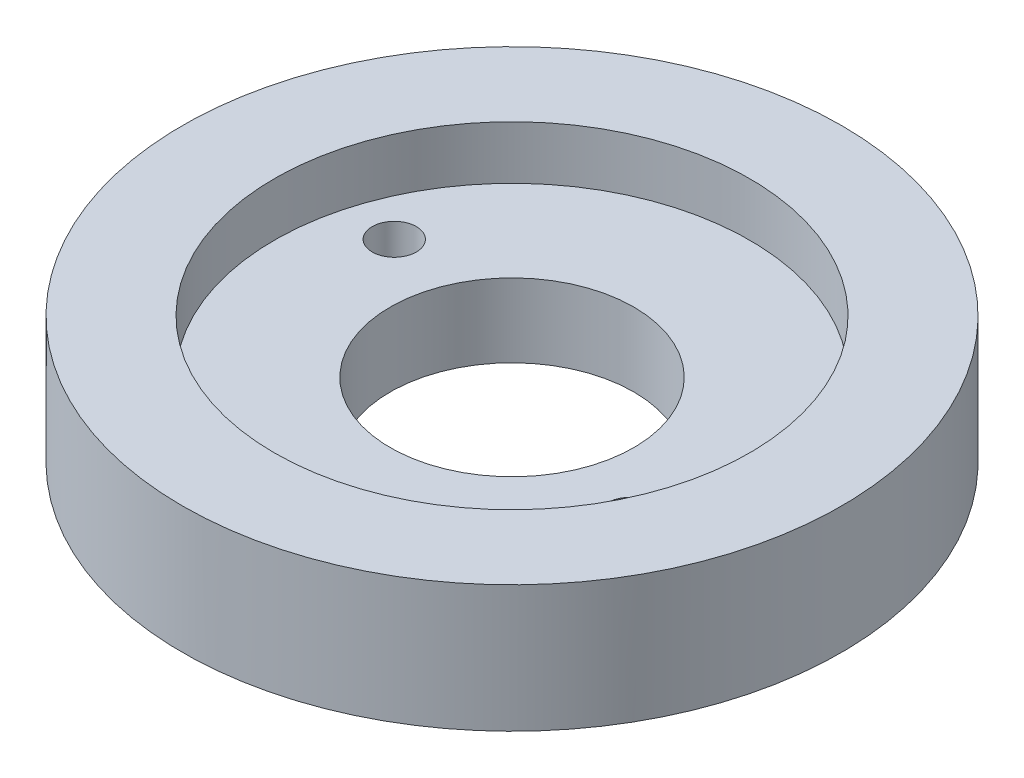
ISO-10303-21;
HEADER;
FILE_DESCRIPTION(('STEP AP214'),'2;1');
FILE_NAME('part.step','',(''),(''),'','','');
FILE_SCHEMA(('AUTOMOTIVE_DESIGN { 1 0 10303 214 1 1 1 1 }'));
ENDSEC;
DATA;
#1=APPLICATION_CONTEXT('core data for automotive mechanical design processes');
#2=APPLICATION_PROTOCOL_DEFINITION('international standard','automotive_design',2000,#1);
#3=PRODUCT_CONTEXT('',#1,'mechanical');
#4=PRODUCT('Part','Part','',(#3));
#5=PRODUCT_RELATED_PRODUCT_CATEGORY('part','',(#4));
#6=PRODUCT_DEFINITION_FORMATION('','',#4);
#7=PRODUCT_DEFINITION_CONTEXT('part definition',#1,'design');
#8=PRODUCT_DEFINITION('design','',#6,#7);
#9=PRODUCT_DEFINITION_SHAPE('','',#8);
#10=(LENGTH_UNIT() NAMED_UNIT(*) SI_UNIT(.MILLI.,.METRE.));
#11=(NAMED_UNIT(*) PLANE_ANGLE_UNIT() SI_UNIT($,.RADIAN.));
#12=(NAMED_UNIT(*) SI_UNIT($,.STERADIAN.) SOLID_ANGLE_UNIT());
#13=UNCERTAINTY_MEASURE_WITH_UNIT(LENGTH_MEASURE(1.E-05),#10,'distance_accuracy_value','');
#14=(GEOMETRIC_REPRESENTATION_CONTEXT(3) GLOBAL_UNCERTAINTY_ASSIGNED_CONTEXT((#13)) GLOBAL_UNIT_ASSIGNED_CONTEXT((#10,
#11,#12)) REPRESENTATION_CONTEXT('',''));
#15=CARTESIAN_POINT('',(0.,0.,0.));
#16=DIRECTION('',(0.,0.,1.));
#17=DIRECTION('',(1.,0.,0.));
#18=AXIS2_PLACEMENT_3D('',#15,#16,#17);
#19=CARTESIAN_POINT('',(0.,11.802411407193,0.));
#20=DIRECTION('',(0.,-1.,0.));
#21=DIRECTION('',(0.,0.,-1.));
#22=AXIS2_PLACEMENT_3D('',#19,#20,#21);
#23=CYLINDRICAL_SURFACE('',#22,35.85);
#24=CARTESIAN_POINT('',(0.,11.802411407193,0.));
#25=DIRECTION('',(0.,1.,0.));
#26=DIRECTION('',(0.,0.,1.));
#27=AXIS2_PLACEMENT_3D('',#24,#25,#26);
#28=CIRCLE('',#27,35.85);
#29=CARTESIAN_POINT('',(0.,11.802411407193,35.85));
#30=VERTEX_POINT('',#29);
#31=EDGE_CURVE('E10',#30,#30,#28,.T.);
#32=ORIENTED_EDGE('',*,*,#31,.F.);
#33=EDGE_LOOP('',(#32));
#34=FACE_BOUND('',#33,.T.);
#35=CARTESIAN_POINT('',(0.,-2.,0.));
#36=DIRECTION('',(0.,-1.,0.));
#37=DIRECTION('',(0.,0.,-1.));
#38=AXIS2_PLACEMENT_3D('',#35,#36,#37);
#39=CIRCLE('',#38,35.85);
#40=CARTESIAN_POINT('',(0.,-2.,-35.85));
#41=VERTEX_POINT('',#40);
#42=EDGE_CURVE('E57',#41,#41,#39,.T.);
#43=ORIENTED_EDGE('',*,*,#42,.F.);
#44=EDGE_LOOP('',(#43));
#45=FACE_BOUND('',#44,.T.);
#46=ADVANCED_FACE('F37',(#34,#45),#23,.T.);
#47=CARTESIAN_POINT('',(0.,11.802411407193,0.));
#48=DIRECTION('',(0.,1.,0.));
#49=DIRECTION('',(0.,0.,1.));
#50=AXIS2_PLACEMENT_3D('',#47,#48,#49);
#51=PLANE('',#50);
#52=CARTESIAN_POINT('',(0.,11.802411407193,0.));
#53=DIRECTION('',(0.,1.,0.));
#54=DIRECTION('',(0.,0.,1.));
#55=AXIS2_PLACEMENT_3D('',#52,#53,#54);
#56=CIRCLE('',#55,25.85);
#57=CARTESIAN_POINT('',(0.,11.802411407193,25.85));
#58=VERTEX_POINT('',#57);
#59=EDGE_CURVE('E45',#58,#58,#56,.T.);
#60=ORIENTED_EDGE('',*,*,#59,.F.);
#61=EDGE_LOOP('',(#60));
#62=FACE_BOUND('',#61,.T.);
#63=ORIENTED_EDGE('',*,*,#31,.T.);
#64=EDGE_LOOP('',(#63));
#65=FACE_BOUND('',#64,.T.);
#66=ADVANCED_FACE('F95',(#62,#65),#51,.T.);
#67=CARTESIAN_POINT('',(0.,6.,0.));
#68=DIRECTION('',(0.,-1.,0.));
#69=DIRECTION('',(0.,0.,-1.));
#70=AXIS2_PLACEMENT_3D('',#67,#68,#69);
#71=CYLINDRICAL_SURFACE('',#70,13.25);
#72=CARTESIAN_POINT('',(0.,6.,0.));
#73=DIRECTION('',(0.,-1.,0.));
#74=DIRECTION('',(0.,0.,-1.));
#75=AXIS2_PLACEMENT_3D('',#72,#73,#74);
#76=CIRCLE('',#75,13.25);
#77=CARTESIAN_POINT('',(0.,6.,-13.25));
#78=VERTEX_POINT('',#77);
#79=EDGE_CURVE('E51',#78,#78,#76,.T.);
#80=ORIENTED_EDGE('',*,*,#79,.F.);
#81=EDGE_LOOP('',(#80));
#82=FACE_BOUND('',#81,.T.);
#83=CARTESIAN_POINT('',(0.,-2.,0.));
#84=DIRECTION('',(0.,-1.,0.));
#85=DIRECTION('',(0.,0.,-1.));
#86=AXIS2_PLACEMENT_3D('',#83,#84,#85);
#87=CIRCLE('',#86,13.25);
#88=CARTESIAN_POINT('',(0.,-2.,-13.25));
#89=VERTEX_POINT('',#88);
#90=EDGE_CURVE('E99',#89,#89,#87,.T.);
#91=ORIENTED_EDGE('',*,*,#90,.T.);
#92=EDGE_LOOP('',(#91));
#93=FACE_BOUND('',#92,.T.);
#94=ADVANCED_FACE('F91',(#82,#93),#71,.F.);
#95=CARTESIAN_POINT('',(0.,11.802411407193,0.));
#96=DIRECTION('',(0.,-1.,0.));
#97=DIRECTION('',(0.,0.,-1.));
#98=AXIS2_PLACEMENT_3D('',#95,#96,#97);
#99=CYLINDRICAL_SURFACE('',#98,25.85);
#100=ORIENTED_EDGE('',*,*,#59,.T.);
#101=EDGE_LOOP('',(#100));
#102=FACE_BOUND('',#101,.T.);
#103=CARTESIAN_POINT('',(0.,6.,0.));
#104=DIRECTION('',(0.,1.,0.));
#105=DIRECTION('',(0.,0.,1.));
#106=AXIS2_PLACEMENT_3D('',#103,#104,#105);
#107=CIRCLE('',#106,25.85);
#108=CARTESIAN_POINT('',(0.,6.,25.85));
#109=VERTEX_POINT('',#108);
#110=EDGE_CURVE('E63',#109,#109,#107,.T.);
#111=ORIENTED_EDGE('',*,*,#110,.F.);
#112=EDGE_LOOP('',(#111));
#113=FACE_BOUND('',#112,.T.);
#114=ADVANCED_FACE('F94',(#102,#113),#99,.F.);
#115=CARTESIAN_POINT('',(0.,6.,0.));
#116=DIRECTION('',(0.,1.,0.));
#117=DIRECTION('',(0.,0.,1.));
#118=AXIS2_PLACEMENT_3D('',#115,#116,#117);
#119=PLANE('',#118);
#120=CARTESIAN_POINT('',(19.4084085829996,6.,6.60027849983237));
#121=DIRECTION('',(0.,1.,0.));
#122=DIRECTION('',(0.,0.,1.));
#123=AXIS2_PLACEMENT_3D('',#120,#121,#122);
#124=CIRCLE('',#123,2.4);
#125=CARTESIAN_POINT('',(19.4084085829996,6.,9.00027849983237));
#126=VERTEX_POINT('',#125);
#127=EDGE_CURVE('E40',#126,#126,#124,.T.);
#128=ORIENTED_EDGE('',*,*,#127,.F.);
#129=EDGE_LOOP('',(#128));
#130=FACE_BOUND('',#129,.T.);
#131=CARTESIAN_POINT('',(-19.4084085829996,6.,-6.60027849983236));
#132=DIRECTION('',(0.,1.,0.));
#133=DIRECTION('',(0.,0.,1.));
#134=AXIS2_PLACEMENT_3D('',#131,#132,#133);
#135=CIRCLE('',#134,2.4);
#136=CARTESIAN_POINT('',(-19.4084085829996,6.,-4.20027849983236));
#137=VERTEX_POINT('',#136);
#138=EDGE_CURVE('E54',#137,#137,#135,.T.);
#139=ORIENTED_EDGE('',*,*,#138,.F.);
#140=EDGE_LOOP('',(#139));
#141=FACE_BOUND('',#140,.T.);
#142=ORIENTED_EDGE('',*,*,#110,.T.);
#143=EDGE_LOOP('',(#142));
#144=FACE_BOUND('',#143,.T.);
#145=ORIENTED_EDGE('',*,*,#79,.T.);
#146=EDGE_LOOP('',(#145));
#147=FACE_BOUND('',#146,.T.);
#148=ADVANCED_FACE('F89',(#130,#141,#144,#147),#119,.T.);
#149=CARTESIAN_POINT('',(-19.4084085829996,18.,-6.60027849983236));
#150=DIRECTION('',(0.,-1.,0.));
#151=DIRECTION('',(0.,0.,-1.));
#152=AXIS2_PLACEMENT_3D('',#149,#150,#151);
#153=CYLINDRICAL_SURFACE('',#152,2.4);
#154=ORIENTED_EDGE('',*,*,#138,.T.);
#155=EDGE_LOOP('',(#154));
#156=FACE_BOUND('',#155,.T.);
#157=CARTESIAN_POINT('',(-19.4084085829996,0.,-6.60027849983236));
#158=DIRECTION('',(0.,-1.,0.));
#159=DIRECTION('',(0.,0.,-1.));
#160=AXIS2_PLACEMENT_3D('',#157,#158,#159);
#161=CIRCLE('',#160,2.4);
#162=CARTESIAN_POINT('',(-19.4084085829996,0.,-9.00027849983237));
#163=VERTEX_POINT('',#162);
#164=EDGE_CURVE('E65',#163,#163,#161,.T.);
#165=ORIENTED_EDGE('',*,*,#164,.T.);
#166=EDGE_LOOP('',(#165));
#167=FACE_BOUND('',#166,.T.);
#168=ADVANCED_FACE('F157',(#156,#167),#153,.F.);
#169=CARTESIAN_POINT('',(19.4084085829996,18.,6.60027849983237));
#170=DIRECTION('',(0.,-1.,0.));
#171=DIRECTION('',(0.,0.,-1.));
#172=AXIS2_PLACEMENT_3D('',#169,#170,#171);
#173=CYLINDRICAL_SURFACE('',#172,2.4);
#174=ORIENTED_EDGE('',*,*,#127,.T.);
#175=EDGE_LOOP('',(#174));
#176=FACE_BOUND('',#175,.T.);
#177=CARTESIAN_POINT('',(19.4084085829996,0.,6.60027849983237));
#178=DIRECTION('',(0.,-1.,0.));
#179=DIRECTION('',(0.,0.,-1.));
#180=AXIS2_PLACEMENT_3D('',#177,#178,#179);
#181=CIRCLE('',#180,2.4);
#182=CARTESIAN_POINT('',(19.4084085829996,0.,4.20027849983236));
#183=VERTEX_POINT('',#182);
#184=EDGE_CURVE('E71',#183,#183,#181,.T.);
#185=ORIENTED_EDGE('',*,*,#184,.T.);
#186=EDGE_LOOP('',(#185));
#187=FACE_BOUND('',#186,.T.);
#188=ADVANCED_FACE('F127',(#176,#187),#173,.F.);
#189=CARTESIAN_POINT('',(0.,-2.,0.));
#190=DIRECTION('',(0.,-1.,0.));
#191=DIRECTION('',(0.,0.,-1.));
#192=AXIS2_PLACEMENT_3D('',#189,#190,#191);
#193=PLANE('',#192);
#194=CARTESIAN_POINT('',(-19.4084085829996,-2.,-6.60027849983236));
#195=DIRECTION('',(0.,-1.,0.));
#196=DIRECTION('',(0.,0.,-1.));
#197=AXIS2_PLACEMENT_3D('',#194,#195,#196);
#198=CIRCLE('',#197,5.);
#199=CARTESIAN_POINT('',(-19.4084085829996,-2.,-11.6002784998324));
#200=VERTEX_POINT('',#199);
#201=EDGE_CURVE('E102',#200,#200,#198,.T.);
#202=ORIENTED_EDGE('',*,*,#201,.F.);
#203=EDGE_LOOP('',(#202));
#204=FACE_BOUND('',#203,.T.);
#205=ORIENTED_EDGE('',*,*,#90,.F.);
#206=EDGE_LOOP('',(#205));
#207=FACE_BOUND('',#206,.T.);
#208=CARTESIAN_POINT('',(19.4084085829996,-2.,6.60027849983237));
#209=DIRECTION('',(0.,-1.,0.));
#210=DIRECTION('',(0.,0.,-1.));
#211=AXIS2_PLACEMENT_3D('',#208,#209,#210);
#212=CIRCLE('',#211,5.);
#213=CARTESIAN_POINT('',(19.4084085829996,-2.,1.60027849983236));
#214=VERTEX_POINT('',#213);
#215=EDGE_CURVE('E103',#214,#214,#212,.T.);
#216=ORIENTED_EDGE('',*,*,#215,.F.);
#217=EDGE_LOOP('',(#216));
#218=FACE_BOUND('',#217,.T.);
#219=ORIENTED_EDGE('',*,*,#42,.T.);
#220=EDGE_LOOP('',(#219));
#221=FACE_BOUND('',#220,.T.);
#222=ADVANCED_FACE('F124',(#204,#207,#218,#221),#193,.T.);
#223=CARTESIAN_POINT('',(19.4084085829996,0.,6.60027849983237));
#224=DIRECTION('',(0.,-1.,0.));
#225=DIRECTION('',(0.,0.,-1.));
#226=AXIS2_PLACEMENT_3D('',#223,#224,#225);
#227=CYLINDRICAL_SURFACE('',#226,5.);
#228=CARTESIAN_POINT('',(19.4084085829996,0.,6.60027849983237));
#229=DIRECTION('',(0.,-1.,0.));
#230=DIRECTION('',(0.,0.,-1.));
#231=AXIS2_PLACEMENT_3D('',#228,#229,#230);
#232=CIRCLE('',#231,5.);
#233=CARTESIAN_POINT('',(19.4084085829996,0.,1.60027849983236));
#234=VERTEX_POINT('',#233);
#235=EDGE_CURVE('E75',#234,#234,#232,.T.);
#236=ORIENTED_EDGE('',*,*,#235,.F.);
#237=EDGE_LOOP('',(#236));
#238=FACE_BOUND('',#237,.T.);
#239=ORIENTED_EDGE('',*,*,#215,.T.);
#240=EDGE_LOOP('',(#239));
#241=FACE_BOUND('',#240,.T.);
#242=ADVANCED_FACE('F126',(#238,#241),#227,.F.);
#243=CARTESIAN_POINT('',(19.4084085829996,0.,6.60027849983237));
#244=DIRECTION('',(0.,-1.,0.));
#245=DIRECTION('',(0.,0.,-1.));
#246=AXIS2_PLACEMENT_3D('',#243,#244,#245);
#247=PLANE('',#246);
#248=ORIENTED_EDGE('',*,*,#184,.F.);
#249=EDGE_LOOP('',(#248));
#250=FACE_BOUND('',#249,.T.);
#251=ORIENTED_EDGE('',*,*,#235,.T.);
#252=EDGE_LOOP('',(#251));
#253=FACE_BOUND('',#252,.T.);
#254=ADVANCED_FACE('F120',(#250,#253),#247,.T.);
#255=CARTESIAN_POINT('',(-19.4084085829996,0.,-6.60027849983236));
#256=DIRECTION('',(0.,-1.,0.));
#257=DIRECTION('',(0.,0.,-1.));
#258=AXIS2_PLACEMENT_3D('',#255,#256,#257);
#259=CYLINDRICAL_SURFACE('',#258,5.);
#260=CARTESIAN_POINT('',(-19.4084085829996,0.,-6.60027849983236));
#261=DIRECTION('',(0.,-1.,0.));
#262=DIRECTION('',(0.,0.,-1.));
#263=AXIS2_PLACEMENT_3D('',#260,#261,#262);
#264=CIRCLE('',#263,5.);
#265=CARTESIAN_POINT('',(-19.4084085829996,0.,-11.6002784998324));
#266=VERTEX_POINT('',#265);
#267=EDGE_CURVE('E79',#266,#266,#264,.T.);
#268=ORIENTED_EDGE('',*,*,#267,.F.);
#269=EDGE_LOOP('',(#268));
#270=FACE_BOUND('',#269,.T.);
#271=ORIENTED_EDGE('',*,*,#201,.T.);
#272=EDGE_LOOP('',(#271));
#273=FACE_BOUND('',#272,.T.);
#274=ADVANCED_FACE('F117',(#270,#273),#259,.F.);
#275=CARTESIAN_POINT('',(-19.4084085829996,0.,-6.60027849983236));
#276=DIRECTION('',(0.,-1.,0.));
#277=DIRECTION('',(0.,0.,-1.));
#278=AXIS2_PLACEMENT_3D('',#275,#276,#277);
#279=PLANE('',#278);
#280=ORIENTED_EDGE('',*,*,#164,.F.);
#281=EDGE_LOOP('',(#280));
#282=FACE_BOUND('',#281,.T.);
#283=ORIENTED_EDGE('',*,*,#267,.T.);
#284=EDGE_LOOP('',(#283));
#285=FACE_BOUND('',#284,.T.);
#286=ADVANCED_FACE('F115',(#282,#285),#279,.T.);
#287=CLOSED_SHELL('',(#46,#66,#94,#114,#148,#168,#188,#222,#242,#254,#274,#286));
#288=MANIFOLD_SOLID_BREP('B2',#287);
#289=ADVANCED_BREP_SHAPE_REPRESENTATION('',(#18,#288),#14);
#290=SHAPE_DEFINITION_REPRESENTATION(#9,#289);
ENDSEC;
END-ISO-10303-21;
